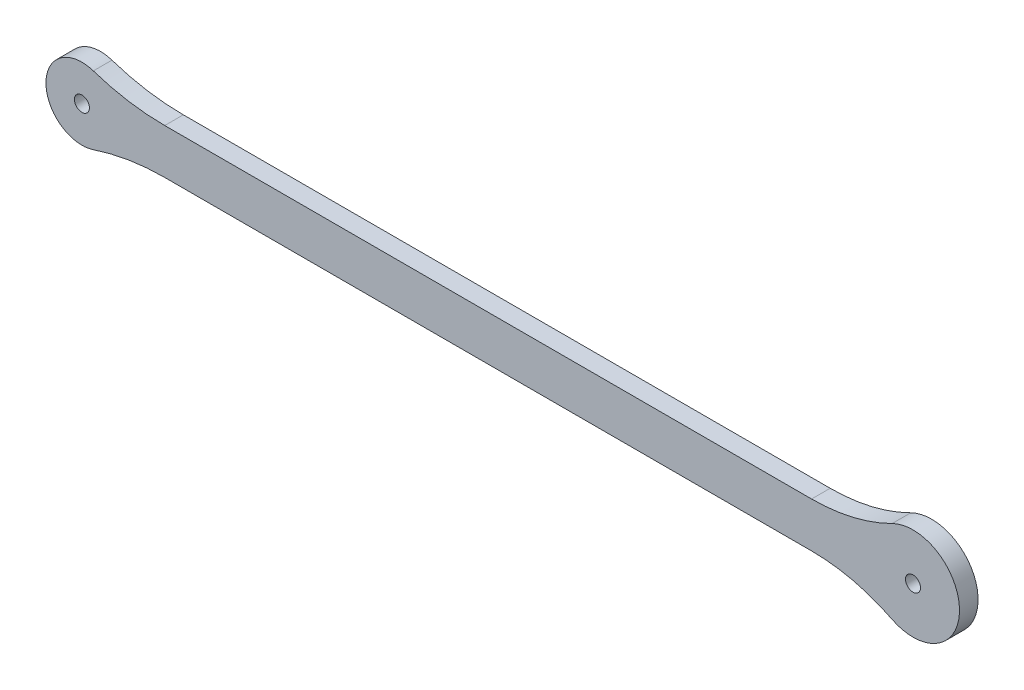
ISO-10303-21;
HEADER;
FILE_DESCRIPTION(('STEP AP214'),'2;1');
FILE_NAME('part.step','',(''),(''),'','','');
FILE_SCHEMA(('AUTOMOTIVE_DESIGN { 1 0 10303 214 1 1 1 1 }'));
ENDSEC;
DATA;
#1=APPLICATION_CONTEXT('core data for automotive mechanical design processes');
#2=APPLICATION_PROTOCOL_DEFINITION('international standard','automotive_design',2000,#1);
#3=PRODUCT_CONTEXT('',#1,'mechanical');
#4=PRODUCT('Part','Part','',(#3));
#5=PRODUCT_RELATED_PRODUCT_CATEGORY('part','',(#4));
#6=PRODUCT_DEFINITION_FORMATION('','',#4);
#7=PRODUCT_DEFINITION_CONTEXT('part definition',#1,'design');
#8=PRODUCT_DEFINITION('design','',#6,#7);
#9=PRODUCT_DEFINITION_SHAPE('','',#8);
#10=(LENGTH_UNIT() NAMED_UNIT(*) SI_UNIT(.MILLI.,.METRE.));
#11=(NAMED_UNIT(*) PLANE_ANGLE_UNIT() SI_UNIT($,.RADIAN.));
#12=(NAMED_UNIT(*) SI_UNIT($,.STERADIAN.) SOLID_ANGLE_UNIT());
#13=UNCERTAINTY_MEASURE_WITH_UNIT(LENGTH_MEASURE(1.E-05),#10,'distance_accuracy_value','');
#14=(GEOMETRIC_REPRESENTATION_CONTEXT(3) GLOBAL_UNCERTAINTY_ASSIGNED_CONTEXT((#13)) GLOBAL_UNIT_ASSIGNED_CONTEXT((#10,
#11,#12)) REPRESENTATION_CONTEXT('',''));
#15=CARTESIAN_POINT('',(0.,0.,0.));
#16=DIRECTION('',(0.,0.,1.));
#17=DIRECTION('',(1.,0.,0.));
#18=AXIS2_PLACEMENT_3D('',#15,#16,#17);
#19=CARTESIAN_POINT('',(104.746949389424,67.5,6.2));
#20=DIRECTION('',(0.,0.,-1.));
#21=DIRECTION('',(-1.,0.,0.));
#22=AXIS2_PLACEMENT_3D('',#19,#20,#21);
#23=CYLINDRICAL_SURFACE('',#22,60.);
#24=CARTESIAN_POINT('',(104.746949389424,67.5,0.));
#25=DIRECTION('',(0.,0.,1.));
#26=DIRECTION('',(1.,0.,0.));
#27=AXIS2_PLACEMENT_3D('',#24,#25,#26);
#28=CIRCLE('',#27,60.);
#29=CARTESIAN_POINT('',(104.746949389424,7.5,0.));
#30=VERTEX_POINT('',#29);
#31=CARTESIAN_POINT('',(131.626209562067,13.8576158940397,0.));
#32=VERTEX_POINT('',#31);
#33=EDGE_CURVE('E136',#30,#32,#28,.T.);
#34=ORIENTED_EDGE('',*,*,#33,.F.);
#35=DIRECTION('',(0.,0.,-1.));
#36=VECTOR('',#35,1.);
#37=CARTESIAN_POINT('',(104.746949389424,7.5,6.2));
#38=LINE('',#37,#36);
#39=CARTESIAN_POINT('',(104.746949389424,7.5,6.2));
#40=VERTEX_POINT('',#39);
#41=EDGE_CURVE('E11',#40,#30,#38,.T.);
#42=ORIENTED_EDGE('',*,*,#41,.F.);
#43=CARTESIAN_POINT('',(104.746949389424,67.5,6.2));
#44=DIRECTION('',(0.,0.,1.));
#45=DIRECTION('',(1.,0.,0.));
#46=AXIS2_PLACEMENT_3D('',#43,#44,#45);
#47=CIRCLE('',#46,60.);
#48=CARTESIAN_POINT('',(131.626209562067,13.8576158940397,6.2));
#49=VERTEX_POINT('',#48);
#50=EDGE_CURVE('E189',#40,#49,#47,.T.);
#51=ORIENTED_EDGE('',*,*,#50,.T.);
#52=DIRECTION('',(0.,0.,-1.));
#53=VECTOR('',#52,1.);
#54=CARTESIAN_POINT('',(131.626209562067,13.8576158940397,6.2));
#55=LINE('',#54,#53);
#56=EDGE_CURVE('E86',#49,#32,#55,.T.);
#57=ORIENTED_EDGE('',*,*,#56,.T.);
#58=EDGE_LOOP('',(#34,#42,#51,#57));
#59=FACE_BOUND('',#58,.T.);
#60=ADVANCED_FACE('F35',(#59),#23,.F.);
#61=CARTESIAN_POINT('',(0.,7.5,6.2));
#62=DIRECTION('',(0.,-1.,0.));
#63=DIRECTION('',(1.,0.,0.));
#64=AXIS2_PLACEMENT_3D('',#61,#62,#63);
#65=PLANE('',#64);
#66=DIRECTION('',(-1.,0.,0.));
#67=VECTOR('',#66,1.);
#68=CARTESIAN_POINT('',(0.,7.5,0.));
#69=LINE('',#68,#67);
#70=CARTESIAN_POINT('',(-110.952089480717,7.49999999999999,0.));
#71=VERTEX_POINT('',#70);
#72=EDGE_CURVE('E139',#30,#71,#69,.T.);
#73=ORIENTED_EDGE('',*,*,#72,.T.);
#74=DIRECTION('',(0.,0.,-1.));
#75=VECTOR('',#74,1.);
#76=CARTESIAN_POINT('',(-110.952089480717,7.49999999999999,6.2));
#77=LINE('',#76,#75);
#78=CARTESIAN_POINT('',(-110.952089480717,7.49999999999999,6.2));
#79=VERTEX_POINT('',#78);
#80=EDGE_CURVE('E44',#79,#71,#77,.T.);
#81=ORIENTED_EDGE('',*,*,#80,.F.);
#82=DIRECTION('',(-1.,0.,0.));
#83=VECTOR('',#82,1.);
#84=CARTESIAN_POINT('',(0.,7.5,6.2));
#85=LINE('',#84,#83);
#86=EDGE_CURVE('E187',#40,#79,#85,.T.);
#87=ORIENTED_EDGE('',*,*,#86,.F.);
#88=ORIENTED_EDGE('',*,*,#41,.T.);
#89=EDGE_LOOP('',(#73,#81,#87,#88));
#90=FACE_BOUND('',#89,.T.);
#91=ADVANCED_FACE('F175',(#90),#65,.F.);
#92=CARTESIAN_POINT('',(-110.952089480717,82.5,6.2));
#93=DIRECTION('',(0.,0.,-1.));
#94=DIRECTION('',(-1.,0.,0.));
#95=AXIS2_PLACEMENT_3D('',#92,#93,#94);
#96=CYLINDRICAL_SURFACE('',#95,75.);
#97=CARTESIAN_POINT('',(-110.952089480717,82.5,0.));
#98=DIRECTION('',(0.,0.,1.));
#99=DIRECTION('',(1.,0.,0.));
#100=AXIS2_PLACEMENT_3D('',#97,#98,#99);
#101=CIRCLE('',#100,75.);
#102=CARTESIAN_POINT('',(-134.760648928375,11.3793103448276,0.));
#103=VERTEX_POINT('',#102);
#104=EDGE_CURVE('E142',#103,#71,#101,.T.);
#105=ORIENTED_EDGE('',*,*,#104,.F.);
#106=DIRECTION('',(0.,0.,-1.));
#107=VECTOR('',#106,1.);
#108=CARTESIAN_POINT('',(-134.760648928375,11.3793103448276,6.2));
#109=LINE('',#108,#107);
#110=CARTESIAN_POINT('',(-134.760648928375,11.3793103448276,6.2));
#111=VERTEX_POINT('',#110);
#112=EDGE_CURVE('E165',#111,#103,#109,.T.);
#113=ORIENTED_EDGE('',*,*,#112,.F.);
#114=CARTESIAN_POINT('',(-110.952089480717,82.5,6.2));
#115=DIRECTION('',(0.,0.,1.));
#116=DIRECTION('',(1.,0.,0.));
#117=AXIS2_PLACEMENT_3D('',#114,#115,#116);
#118=CIRCLE('',#117,75.);
#119=EDGE_CURVE('E172',#111,#79,#118,.T.);
#120=ORIENTED_EDGE('',*,*,#119,.T.);
#121=ORIENTED_EDGE('',*,*,#80,.T.);
#122=EDGE_LOOP('',(#105,#113,#120,#121));
#123=FACE_BOUND('',#122,.T.);
#124=ADVANCED_FACE('F170',(#123),#96,.F.);
#125=CARTESIAN_POINT('',(-138.57001844,0.,6.2));
#126=DIRECTION('',(0.,0.,-1.));
#127=DIRECTION('',(-1.,0.,0.));
#128=AXIS2_PLACEMENT_3D('',#125,#126,#127);
#129=CYLINDRICAL_SURFACE('',#128,12.);
#130=CARTESIAN_POINT('',(-138.57001844,0.,0.));
#131=DIRECTION('',(0.,0.,1.));
#132=DIRECTION('',(1.,0.,0.));
#133=AXIS2_PLACEMENT_3D('',#130,#131,#132);
#134=CIRCLE('',#133,12.);
#135=CARTESIAN_POINT('',(-134.760648928375,-11.3793103448276,0.));
#136=VERTEX_POINT('',#135);
#137=EDGE_CURVE('E145',#103,#136,#134,.T.);
#138=ORIENTED_EDGE('',*,*,#137,.T.);
#139=DIRECTION('',(0.,0.,-1.));
#140=VECTOR('',#139,1.);
#141=CARTESIAN_POINT('',(-134.760648928375,-11.3793103448276,6.2));
#142=LINE('',#141,#140);
#143=CARTESIAN_POINT('',(-134.760648928375,-11.3793103448276,6.2));
#144=VERTEX_POINT('',#143);
#145=EDGE_CURVE('E163',#144,#136,#142,.T.);
#146=ORIENTED_EDGE('',*,*,#145,.F.);
#147=CARTESIAN_POINT('',(-138.57001844,0.,6.2));
#148=DIRECTION('',(0.,0.,1.));
#149=DIRECTION('',(1.,0.,0.));
#150=AXIS2_PLACEMENT_3D('',#147,#148,#149);
#151=CIRCLE('',#150,12.);
#152=EDGE_CURVE('E185',#111,#144,#151,.T.);
#153=ORIENTED_EDGE('',*,*,#152,.F.);
#154=ORIENTED_EDGE('',*,*,#112,.T.);
#155=EDGE_LOOP('',(#138,#146,#153,#154));
#156=FACE_BOUND('',#155,.T.);
#157=ADVANCED_FACE('F183',(#156),#129,.T.);
#158=CARTESIAN_POINT('',(-110.952089480717,-82.5,6.2));
#159=DIRECTION('',(0.,0.,-1.));
#160=DIRECTION('',(-1.,0.,0.));
#161=AXIS2_PLACEMENT_3D('',#158,#159,#160);
#162=CYLINDRICAL_SURFACE('',#161,75.);
#163=CARTESIAN_POINT('',(-110.952089480717,-82.5,0.));
#164=DIRECTION('',(0.,0.,1.));
#165=DIRECTION('',(1.,0.,0.));
#166=AXIS2_PLACEMENT_3D('',#163,#164,#165);
#167=CIRCLE('',#166,75.);
#168=CARTESIAN_POINT('',(-110.952089480717,-7.49999999999999,0.));
#169=VERTEX_POINT('',#168);
#170=EDGE_CURVE('E148',#169,#136,#167,.T.);
#171=ORIENTED_EDGE('',*,*,#170,.F.);
#172=DIRECTION('',(0.,0.,-1.));
#173=VECTOR('',#172,1.);
#174=CARTESIAN_POINT('',(-110.952089480717,-7.49999999999999,6.2));
#175=LINE('',#174,#173);
#176=CARTESIAN_POINT('',(-110.952089480717,-7.49999999999999,6.2));
#177=VERTEX_POINT('',#176);
#178=EDGE_CURVE('E123',#177,#169,#175,.T.);
#179=ORIENTED_EDGE('',*,*,#178,.F.);
#180=CARTESIAN_POINT('',(-110.952089480717,-82.5,6.2));
#181=DIRECTION('',(0.,0.,1.));
#182=DIRECTION('',(1.,0.,0.));
#183=AXIS2_PLACEMENT_3D('',#180,#181,#182);
#184=CIRCLE('',#183,75.);
#185=EDGE_CURVE('E112',#177,#144,#184,.T.);
#186=ORIENTED_EDGE('',*,*,#185,.T.);
#187=ORIENTED_EDGE('',*,*,#145,.T.);
#188=EDGE_LOOP('',(#171,#179,#186,#187));
#189=FACE_BOUND('',#188,.T.);
#190=ADVANCED_FACE('F193',(#189),#162,.F.);
#191=CARTESIAN_POINT('',(0.,-7.5,6.2));
#192=DIRECTION('',(0.,1.,0.));
#193=DIRECTION('',(-1.,0.,0.));
#194=AXIS2_PLACEMENT_3D('',#191,#192,#193);
#195=PLANE('',#194);
#196=DIRECTION('',(1.,0.,0.));
#197=VECTOR('',#196,1.);
#198=CARTESIAN_POINT('',(0.,-7.5,0.));
#199=LINE('',#198,#197);
#200=CARTESIAN_POINT('',(104.746949389424,-7.5,0.));
#201=VERTEX_POINT('',#200);
#202=EDGE_CURVE('E119',#169,#201,#199,.T.);
#203=ORIENTED_EDGE('',*,*,#202,.T.);
#204=DIRECTION('',(0.,0.,-1.));
#205=VECTOR('',#204,1.);
#206=CARTESIAN_POINT('',(104.746949389424,-7.5,6.2));
#207=LINE('',#206,#205);
#208=CARTESIAN_POINT('',(104.746949389424,-7.5,6.2));
#209=VERTEX_POINT('',#208);
#210=EDGE_CURVE('E116',#209,#201,#207,.T.);
#211=ORIENTED_EDGE('',*,*,#210,.F.);
#212=DIRECTION('',(1.,0.,0.));
#213=VECTOR('',#212,1.);
#214=CARTESIAN_POINT('',(0.,-7.5,6.2));
#215=LINE('',#214,#213);
#216=EDGE_CURVE('E105',#177,#209,#215,.T.);
#217=ORIENTED_EDGE('',*,*,#216,.F.);
#218=ORIENTED_EDGE('',*,*,#178,.T.);
#219=EDGE_LOOP('',(#203,#211,#217,#218));
#220=FACE_BOUND('',#219,.T.);
#221=ADVANCED_FACE('F117',(#220),#195,.F.);
#222=CARTESIAN_POINT('',(104.746949389424,-67.5,6.2));
#223=DIRECTION('',(0.,0.,-1.));
#224=DIRECTION('',(-1.,0.,0.));
#225=AXIS2_PLACEMENT_3D('',#222,#223,#224);
#226=CYLINDRICAL_SURFACE('',#225,60.);
#227=CARTESIAN_POINT('',(104.746949389424,-67.5,0.));
#228=DIRECTION('',(0.,0.,1.));
#229=DIRECTION('',(1.,0.,0.));
#230=AXIS2_PLACEMENT_3D('',#227,#228,#229);
#231=CIRCLE('',#230,60.);
#232=CARTESIAN_POINT('',(131.626209562067,-13.8576158940397,0.));
#233=VERTEX_POINT('',#232);
#234=EDGE_CURVE('E152',#233,#201,#231,.T.);
#235=ORIENTED_EDGE('',*,*,#234,.F.);
#236=DIRECTION('',(0.,0.,-1.));
#237=VECTOR('',#236,1.);
#238=CARTESIAN_POINT('',(131.626209562067,-13.8576158940397,6.2));
#239=LINE('',#238,#237);
#240=CARTESIAN_POINT('',(131.626209562067,-13.8576158940397,6.2));
#241=VERTEX_POINT('',#240);
#242=EDGE_CURVE('E79',#241,#233,#239,.T.);
#243=ORIENTED_EDGE('',*,*,#242,.F.);
#244=CARTESIAN_POINT('',(104.746949389424,-67.5,6.2));
#245=DIRECTION('',(0.,0.,1.));
#246=DIRECTION('',(1.,0.,0.));
#247=AXIS2_PLACEMENT_3D('',#244,#245,#246);
#248=CIRCLE('',#247,60.);
#249=EDGE_CURVE('E110',#241,#209,#248,.T.);
#250=ORIENTED_EDGE('',*,*,#249,.T.);
#251=ORIENTED_EDGE('',*,*,#210,.T.);
#252=EDGE_LOOP('',(#235,#243,#250,#251));
#253=FACE_BOUND('',#252,.T.);
#254=ADVANCED_FACE('F125',(#253),#226,.F.);
#255=CARTESIAN_POINT('',(138.57001844,0.,6.2));
#256=DIRECTION('',(0.,0.,-1.));
#257=DIRECTION('',(-1.,0.,0.));
#258=AXIS2_PLACEMENT_3D('',#255,#256,#257);
#259=CYLINDRICAL_SURFACE('',#258,15.5);
#260=CARTESIAN_POINT('',(138.57001844,0.,0.));
#261=DIRECTION('',(0.,0.,1.));
#262=DIRECTION('',(1.,0.,0.));
#263=AXIS2_PLACEMENT_3D('',#260,#261,#262);
#264=CIRCLE('',#263,15.5);
#265=EDGE_CURVE('E154',#233,#32,#264,.T.);
#266=ORIENTED_EDGE('',*,*,#265,.T.);
#267=ORIENTED_EDGE('',*,*,#56,.F.);
#268=CARTESIAN_POINT('',(138.57001844,0.,6.2));
#269=DIRECTION('',(0.,0.,1.));
#270=DIRECTION('',(1.,0.,0.));
#271=AXIS2_PLACEMENT_3D('',#268,#269,#270);
#272=CIRCLE('',#271,15.5);
#273=EDGE_CURVE('E52',#241,#49,#272,.T.);
#274=ORIENTED_EDGE('',*,*,#273,.F.);
#275=ORIENTED_EDGE('',*,*,#242,.T.);
#276=EDGE_LOOP('',(#266,#267,#274,#275));
#277=FACE_BOUND('',#276,.T.);
#278=ADVANCED_FACE('F194',(#277),#259,.T.);
#279=CARTESIAN_POINT('',(138.57001844,0.,6.2));
#280=DIRECTION('',(0.,0.,-1.));
#281=DIRECTION('',(-1.,0.,0.));
#282=AXIS2_PLACEMENT_3D('',#279,#280,#281);
#283=CYLINDRICAL_SURFACE('',#282,2.5);
#284=CARTESIAN_POINT('',(138.57001844,0.,6.2));
#285=DIRECTION('',(0.,0.,1.));
#286=DIRECTION('',(1.,0.,0.));
#287=AXIS2_PLACEMENT_3D('',#284,#285,#286);
#288=CIRCLE('',#287,2.5);
#289=CARTESIAN_POINT('',(136.07001844,0.,6.2));
#290=VERTEX_POINT('',#289);
#291=EDGE_CURVE('E159',#290,#290,#288,.T.);
#292=CARTESIAN_POINT('',(138.57001844,0.,0.));
#293=DIRECTION('',(0.,0.,1.));
#294=DIRECTION('',(1.,0.,0.));
#295=AXIS2_PLACEMENT_3D('',#292,#293,#294);
#296=CIRCLE('',#295,2.5);
#297=CARTESIAN_POINT('',(136.07001844,0.,0.));
#298=VERTEX_POINT('',#297);
#299=EDGE_CURVE('E133',#298,#298,#296,.T.);
#300=CARTESIAN_POINT('',(136.07001844,0.,6.2));
#301=CARTESIAN_POINT('',(136.07001844,0.,6.13541666666667));
#302=CARTESIAN_POINT('',(136.07001844,0.,6.07083333333333));
#303=CARTESIAN_POINT('',(136.07001844,0.,5.94166666666667));
#304=CARTESIAN_POINT('',(136.07001844,0.,5.87708333333333));
#305=CARTESIAN_POINT('',(136.07001844,0.,5.74791666666667));
#306=CARTESIAN_POINT('',(136.07001844,0.,5.68333333333333));
#307=CARTESIAN_POINT('',(136.07001844,0.,5.55416666666667));
#308=CARTESIAN_POINT('',(136.07001844,0.,5.48958333333333));
#309=CARTESIAN_POINT('',(136.07001844,0.,5.36041666666667));
#310=CARTESIAN_POINT('',(136.07001844,0.,5.29583333333333));
#311=CARTESIAN_POINT('',(136.07001844,0.,5.16666666666667));
#312=CARTESIAN_POINT('',(136.07001844,0.,5.10208333333333));
#313=CARTESIAN_POINT('',(136.07001844,0.,4.97291666666667));
#314=CARTESIAN_POINT('',(136.07001844,0.,4.90833333333333));
#315=CARTESIAN_POINT('',(136.07001844,0.,4.77916666666667));
#316=CARTESIAN_POINT('',(136.07001844,0.,4.71458333333333));
#317=CARTESIAN_POINT('',(136.07001844,0.,4.58541666666667));
#318=CARTESIAN_POINT('',(136.07001844,0.,4.52083333333333));
#319=CARTESIAN_POINT('',(136.07001844,0.,4.39166666666667));
#320=CARTESIAN_POINT('',(136.07001844,0.,4.32708333333333));
#321=CARTESIAN_POINT('',(136.07001844,0.,4.19791666666667));
#322=CARTESIAN_POINT('',(136.07001844,0.,4.13333333333333));
#323=CARTESIAN_POINT('',(136.07001844,0.,4.00416666666667));
#324=CARTESIAN_POINT('',(136.07001844,0.,3.93958333333333));
#325=CARTESIAN_POINT('',(136.07001844,0.,3.81041666666667));
#326=CARTESIAN_POINT('',(136.07001844,0.,3.74583333333333));
#327=CARTESIAN_POINT('',(136.07001844,0.,3.61666666666667));
#328=CARTESIAN_POINT('',(136.07001844,0.,3.55208333333333));
#329=CARTESIAN_POINT('',(136.07001844,0.,3.42291666666667));
#330=CARTESIAN_POINT('',(136.07001844,0.,3.35833333333333));
#331=CARTESIAN_POINT('',(136.07001844,0.,3.22916666666667));
#332=CARTESIAN_POINT('',(136.07001844,0.,3.16458333333333));
#333=CARTESIAN_POINT('',(136.07001844,0.,3.03541666666667));
#334=CARTESIAN_POINT('',(136.07001844,0.,2.97083333333333));
#335=CARTESIAN_POINT('',(136.07001844,0.,2.84166666666667));
#336=CARTESIAN_POINT('',(136.07001844,0.,2.77708333333333));
#337=CARTESIAN_POINT('',(136.07001844,0.,2.64791666666667));
#338=CARTESIAN_POINT('',(136.07001844,0.,2.58333333333333));
#339=CARTESIAN_POINT('',(136.07001844,0.,2.45416666666667));
#340=CARTESIAN_POINT('',(136.07001844,0.,2.38958333333333));
#341=CARTESIAN_POINT('',(136.07001844,0.,2.26041666666667));
#342=CARTESIAN_POINT('',(136.07001844,0.,2.19583333333333));
#343=CARTESIAN_POINT('',(136.07001844,0.,2.06666666666667));
#344=CARTESIAN_POINT('',(136.07001844,0.,2.00208333333333));
#345=CARTESIAN_POINT('',(136.07001844,0.,1.87291666666667));
#346=CARTESIAN_POINT('',(136.07001844,0.,1.80833333333333));
#347=CARTESIAN_POINT('',(136.07001844,0.,1.67916666666667));
#348=CARTESIAN_POINT('',(136.07001844,0.,1.61458333333333));
#349=CARTESIAN_POINT('',(136.07001844,0.,1.48541666666667));
#350=CARTESIAN_POINT('',(136.07001844,0.,1.42083333333333));
#351=CARTESIAN_POINT('',(136.07001844,0.,1.29166666666667));
#352=CARTESIAN_POINT('',(136.07001844,0.,1.22708333333333));
#353=CARTESIAN_POINT('',(136.07001844,0.,1.09791666666667));
#354=CARTESIAN_POINT('',(136.07001844,0.,1.03333333333333));
#355=CARTESIAN_POINT('',(136.07001844,0.,0.904166666666667));
#356=CARTESIAN_POINT('',(136.07001844,0.,0.839583333333333));
#357=CARTESIAN_POINT('',(136.07001844,0.,0.710416666666666));
#358=CARTESIAN_POINT('',(136.07001844,0.,0.645833333333333));
#359=CARTESIAN_POINT('',(136.07001844,0.,0.516666666666667));
#360=CARTESIAN_POINT('',(136.07001844,0.,0.452083333333333));
#361=CARTESIAN_POINT('',(136.07001844,0.,0.322916666666667));
#362=CARTESIAN_POINT('',(136.07001844,0.,0.258333333333334));
#363=CARTESIAN_POINT('',(136.07001844,0.,0.129166666666667));
#364=CARTESIAN_POINT('',(136.07001844,0.,0.0645833333333335));
#365=CARTESIAN_POINT('',(136.07001844,0.,0.));
#366=B_SPLINE_CURVE_WITH_KNOTS('',3,(#300,#301,#302,#303,#304,#305,#306,#307,#308,#309,#310,
#311,#312,#313,#314,#315,#316,#317,#318,#319,#320,#321,#322,#323,#324,#325,#326,#327,#328,#329,
#330,#331,#332,#333,#334,#335,#336,#337,#338,#339,#340,#341,#342,#343,#344,#345,#346,#347,#348,
#349,#350,#351,#352,#353,#354,#355,#356,#357,#358,#359,#360,#361,#362,#363,#364,#365),
.UNSPECIFIED.,.F.,.F.,(4,2,2,2,2,2,2,2,2,2,2,2,2,2,2,2,2,2,2,2,2,2,2,2,2,2,2,2,2,2,2,2,4),(0.,
0.193749999999999,0.3875,0.581249999999999,0.775,0.968749999999999,1.1625,1.35625,1.55,1.74375,
1.9375,2.13125,2.325,2.51875,2.7125,2.90625,3.1,3.29375,3.4875,3.68125,3.875,4.06875,4.2625,
4.45625,4.65,4.84375,5.0375,5.23125,5.425,5.61875,5.8125,6.00625,6.2),.UNSPECIFIED.);
#367=EDGE_CURVE('BSEAM37',#290,#298,#366,.T.);
#368=ORIENTED_EDGE('',*,*,#291,.T.);
#369=ORIENTED_EDGE('',*,*,#299,.F.);
#370=ORIENTED_EDGE('',*,*,#367,.T.);
#371=ORIENTED_EDGE('',*,*,#367,.F.);
#372=EDGE_LOOP('',(#368,#370,#369,#371));
#373=FACE_BOUND('',#372,.T.);
#374=ADVANCED_FACE('F37',(#373),#283,.F.);
#375=CARTESIAN_POINT('',(-138.57001844,0.,6.2));
#376=DIRECTION('',(0.,0.,-1.));
#377=DIRECTION('',(-1.,0.,0.));
#378=AXIS2_PLACEMENT_3D('',#375,#376,#377);
#379=CYLINDRICAL_SURFACE('',#378,2.5);
#380=CARTESIAN_POINT('',(-138.57001844,0.,6.2));
#381=DIRECTION('',(0.,0.,1.));
#382=DIRECTION('',(1.,0.,0.));
#383=AXIS2_PLACEMENT_3D('',#380,#381,#382);
#384=CIRCLE('',#383,2.5);
#385=CARTESIAN_POINT('',(-141.07001844,0.,6.2));
#386=VERTEX_POINT('',#385);
#387=EDGE_CURVE('E127',#386,#386,#384,.T.);
#388=CARTESIAN_POINT('',(-138.57001844,0.,0.));
#389=DIRECTION('',(0.,0.,1.));
#390=DIRECTION('',(1.,0.,0.));
#391=AXIS2_PLACEMENT_3D('',#388,#389,#390);
#392=CIRCLE('',#391,2.5);
#393=CARTESIAN_POINT('',(-141.07001844,0.,0.));
#394=VERTEX_POINT('',#393);
#395=EDGE_CURVE('E156',#394,#394,#392,.T.);
#396=CARTESIAN_POINT('',(-141.07001844,0.,6.2));
#397=CARTESIAN_POINT('',(-141.07001844,0.,6.13541666666667));
#398=CARTESIAN_POINT('',(-141.07001844,0.,6.07083333333333));
#399=CARTESIAN_POINT('',(-141.07001844,0.,5.94166666666667));
#400=CARTESIAN_POINT('',(-141.07001844,0.,5.87708333333333));
#401=CARTESIAN_POINT('',(-141.07001844,0.,5.74791666666667));
#402=CARTESIAN_POINT('',(-141.07001844,0.,5.68333333333333));
#403=CARTESIAN_POINT('',(-141.07001844,0.,5.55416666666667));
#404=CARTESIAN_POINT('',(-141.07001844,0.,5.48958333333333));
#405=CARTESIAN_POINT('',(-141.07001844,0.,5.36041666666667));
#406=CARTESIAN_POINT('',(-141.07001844,0.,5.29583333333333));
#407=CARTESIAN_POINT('',(-141.07001844,0.,5.16666666666667));
#408=CARTESIAN_POINT('',(-141.07001844,0.,5.10208333333333));
#409=CARTESIAN_POINT('',(-141.07001844,0.,4.97291666666667));
#410=CARTESIAN_POINT('',(-141.07001844,0.,4.90833333333333));
#411=CARTESIAN_POINT('',(-141.07001844,0.,4.77916666666667));
#412=CARTESIAN_POINT('',(-141.07001844,0.,4.71458333333333));
#413=CARTESIAN_POINT('',(-141.07001844,0.,4.58541666666667));
#414=CARTESIAN_POINT('',(-141.07001844,0.,4.52083333333333));
#415=CARTESIAN_POINT('',(-141.07001844,0.,4.39166666666667));
#416=CARTESIAN_POINT('',(-141.07001844,0.,4.32708333333333));
#417=CARTESIAN_POINT('',(-141.07001844,0.,4.19791666666667));
#418=CARTESIAN_POINT('',(-141.07001844,0.,4.13333333333333));
#419=CARTESIAN_POINT('',(-141.07001844,0.,4.00416666666667));
#420=CARTESIAN_POINT('',(-141.07001844,0.,3.93958333333333));
#421=CARTESIAN_POINT('',(-141.07001844,0.,3.81041666666667));
#422=CARTESIAN_POINT('',(-141.07001844,0.,3.74583333333333));
#423=CARTESIAN_POINT('',(-141.07001844,0.,3.61666666666667));
#424=CARTESIAN_POINT('',(-141.07001844,0.,3.55208333333333));
#425=CARTESIAN_POINT('',(-141.07001844,0.,3.42291666666667));
#426=CARTESIAN_POINT('',(-141.07001844,0.,3.35833333333333));
#427=CARTESIAN_POINT('',(-141.07001844,0.,3.22916666666667));
#428=CARTESIAN_POINT('',(-141.07001844,0.,3.16458333333333));
#429=CARTESIAN_POINT('',(-141.07001844,0.,3.03541666666667));
#430=CARTESIAN_POINT('',(-141.07001844,0.,2.97083333333333));
#431=CARTESIAN_POINT('',(-141.07001844,0.,2.84166666666667));
#432=CARTESIAN_POINT('',(-141.07001844,0.,2.77708333333333));
#433=CARTESIAN_POINT('',(-141.07001844,0.,2.64791666666667));
#434=CARTESIAN_POINT('',(-141.07001844,0.,2.58333333333333));
#435=CARTESIAN_POINT('',(-141.07001844,0.,2.45416666666667));
#436=CARTESIAN_POINT('',(-141.07001844,0.,2.38958333333333));
#437=CARTESIAN_POINT('',(-141.07001844,0.,2.26041666666667));
#438=CARTESIAN_POINT('',(-141.07001844,0.,2.19583333333333));
#439=CARTESIAN_POINT('',(-141.07001844,0.,2.06666666666667));
#440=CARTESIAN_POINT('',(-141.07001844,0.,2.00208333333333));
#441=CARTESIAN_POINT('',(-141.07001844,0.,1.87291666666667));
#442=CARTESIAN_POINT('',(-141.07001844,0.,1.80833333333333));
#443=CARTESIAN_POINT('',(-141.07001844,0.,1.67916666666667));
#444=CARTESIAN_POINT('',(-141.07001844,0.,1.61458333333333));
#445=CARTESIAN_POINT('',(-141.07001844,0.,1.48541666666667));
#446=CARTESIAN_POINT('',(-141.07001844,0.,1.42083333333333));
#447=CARTESIAN_POINT('',(-141.07001844,0.,1.29166666666667));
#448=CARTESIAN_POINT('',(-141.07001844,0.,1.22708333333333));
#449=CARTESIAN_POINT('',(-141.07001844,0.,1.09791666666667));
#450=CARTESIAN_POINT('',(-141.07001844,0.,1.03333333333333));
#451=CARTESIAN_POINT('',(-141.07001844,0.,0.904166666666667));
#452=CARTESIAN_POINT('',(-141.07001844,0.,0.839583333333333));
#453=CARTESIAN_POINT('',(-141.07001844,0.,0.710416666666666));
#454=CARTESIAN_POINT('',(-141.07001844,0.,0.645833333333333));
#455=CARTESIAN_POINT('',(-141.07001844,0.,0.516666666666667));
#456=CARTESIAN_POINT('',(-141.07001844,0.,0.452083333333333));
#457=CARTESIAN_POINT('',(-141.07001844,0.,0.322916666666667));
#458=CARTESIAN_POINT('',(-141.07001844,0.,0.258333333333334));
#459=CARTESIAN_POINT('',(-141.07001844,0.,0.129166666666667));
#460=CARTESIAN_POINT('',(-141.07001844,0.,0.0645833333333335));
#461=CARTESIAN_POINT('',(-141.07001844,0.,0.));
#462=B_SPLINE_CURVE_WITH_KNOTS('',3,(#396,#397,#398,#399,#400,#401,#402,#403,#404,#405,#406,
#407,#408,#409,#410,#411,#412,#413,#414,#415,#416,#417,#418,#419,#420,#421,#422,#423,#424,#425,
#426,#427,#428,#429,#430,#431,#432,#433,#434,#435,#436,#437,#438,#439,#440,#441,#442,#443,#444,
#445,#446,#447,#448,#449,#450,#451,#452,#453,#454,#455,#456,#457,#458,#459,#460,#461),
.UNSPECIFIED.,.F.,.F.,(4,2,2,2,2,2,2,2,2,2,2,2,2,2,2,2,2,2,2,2,2,2,2,2,2,2,2,2,2,2,2,2,4),(0.,
0.193749999999999,0.3875,0.581249999999999,0.775,0.968749999999999,1.1625,1.35625,1.55,1.74375,
1.9375,2.13125,2.325,2.51875,2.7125,2.90625,3.1,3.29375,3.4875,3.68125,3.875,4.06875,4.2625,
4.45625,4.65,4.84375,5.0375,5.23125,5.425,5.61875,5.8125,6.00625,6.2),.UNSPECIFIED.);
#463=EDGE_CURVE('BSEAM202',#386,#394,#462,.T.);
#464=ORIENTED_EDGE('',*,*,#387,.T.);
#465=ORIENTED_EDGE('',*,*,#395,.F.);
#466=ORIENTED_EDGE('',*,*,#463,.T.);
#467=ORIENTED_EDGE('',*,*,#463,.F.);
#468=EDGE_LOOP('',(#464,#466,#465,#467));
#469=FACE_BOUND('',#468,.T.);
#470=ADVANCED_FACE('F202',(#469),#379,.F.);
#471=CARTESIAN_POINT('',(0.,0.,6.2));
#472=DIRECTION('',(0.,0.,1.));
#473=DIRECTION('',(1.,0.,0.));
#474=AXIS2_PLACEMENT_3D('',#471,#472,#473);
#475=PLANE('',#474);
#476=ORIENTED_EDGE('',*,*,#291,.F.);
#477=EDGE_LOOP('',(#476));
#478=FACE_BOUND('',#477,.T.);
#479=ORIENTED_EDGE('',*,*,#50,.F.);
#480=ORIENTED_EDGE('',*,*,#86,.T.);
#481=ORIENTED_EDGE('',*,*,#119,.F.);
#482=ORIENTED_EDGE('',*,*,#152,.T.);
#483=ORIENTED_EDGE('',*,*,#185,.F.);
#484=ORIENTED_EDGE('',*,*,#216,.T.);
#485=ORIENTED_EDGE('',*,*,#249,.F.);
#486=ORIENTED_EDGE('',*,*,#273,.T.);
#487=EDGE_LOOP('',(#479,#480,#481,#482,#483,#484,#485,#486));
#488=FACE_BOUND('',#487,.T.);
#489=ORIENTED_EDGE('',*,*,#387,.F.);
#490=EDGE_LOOP('',(#489));
#491=FACE_BOUND('',#490,.T.);
#492=ADVANCED_FACE('F107',(#478,#488,#491),#475,.T.);
#493=CARTESIAN_POINT('',(0.,0.,0.));
#494=DIRECTION('',(0.,0.,1.));
#495=DIRECTION('',(1.,0.,0.));
#496=AXIS2_PLACEMENT_3D('',#493,#494,#495);
#497=PLANE('',#496);
#498=ORIENTED_EDGE('',*,*,#299,.T.);
#499=EDGE_LOOP('',(#498));
#500=FACE_BOUND('',#499,.T.);
#501=ORIENTED_EDGE('',*,*,#33,.T.);
#502=ORIENTED_EDGE('',*,*,#265,.F.);
#503=ORIENTED_EDGE('',*,*,#234,.T.);
#504=ORIENTED_EDGE('',*,*,#202,.F.);
#505=ORIENTED_EDGE('',*,*,#170,.T.);
#506=ORIENTED_EDGE('',*,*,#137,.F.);
#507=ORIENTED_EDGE('',*,*,#104,.T.);
#508=ORIENTED_EDGE('',*,*,#72,.F.);
#509=EDGE_LOOP('',(#501,#502,#503,#504,#505,#506,#507,#508));
#510=FACE_BOUND('',#509,.T.);
#511=ORIENTED_EDGE('',*,*,#395,.T.);
#512=EDGE_LOOP('',(#511));
#513=FACE_BOUND('',#512,.T.);
#514=ADVANCED_FACE('F178',(#500,#510,#513),#497,.F.);
#515=CLOSED_SHELL('',(#60,#91,#124,#157,#190,#221,#254,#278,#374,#470,#492,#514));
#516=MANIFOLD_SOLID_BREP('B2',#515);
#517=ADVANCED_BREP_SHAPE_REPRESENTATION('',(#18,#516),#14);
#518=SHAPE_DEFINITION_REPRESENTATION(#9,#517);
ENDSEC;
END-ISO-10303-21;
